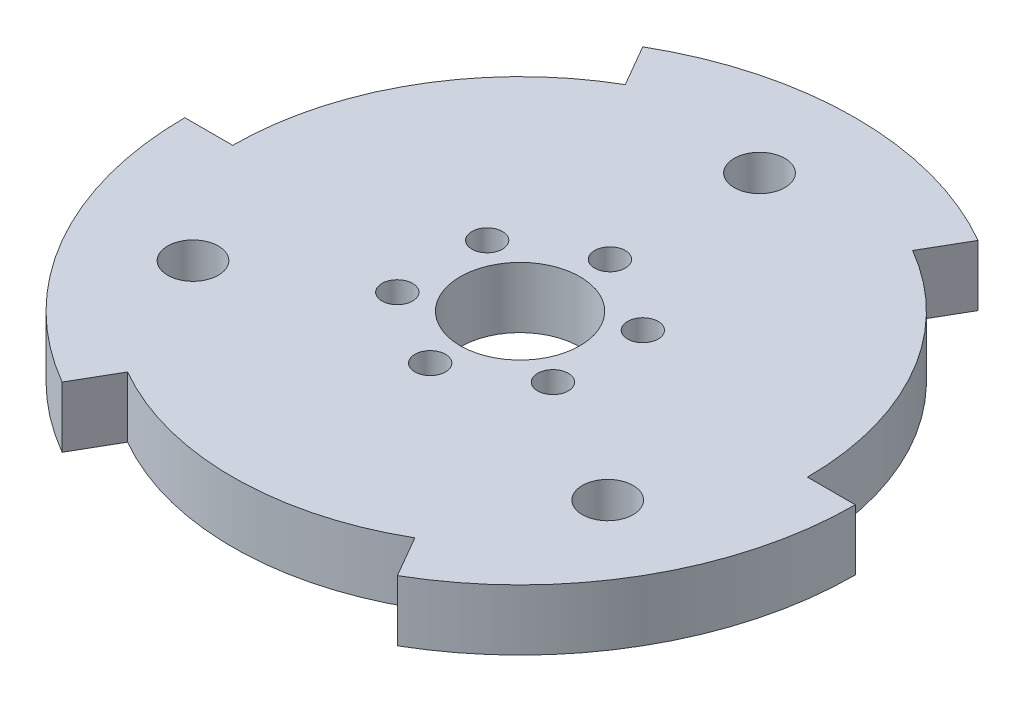
ISO-10303-21;
HEADER;
FILE_DESCRIPTION(('STEP AP214'),'2;1');
FILE_NAME('part.step','',(''),(''),'','','');
FILE_SCHEMA(('AUTOMOTIVE_DESIGN { 1 0 10303 214 1 1 1 1 }'));
ENDSEC;
DATA;
#1=APPLICATION_CONTEXT('core data for automotive mechanical design processes');
#2=APPLICATION_PROTOCOL_DEFINITION('international standard','automotive_design',2000,#1);
#3=PRODUCT_CONTEXT('',#1,'mechanical');
#4=PRODUCT('Part','Part','',(#3));
#5=PRODUCT_RELATED_PRODUCT_CATEGORY('part','',(#4));
#6=PRODUCT_DEFINITION_FORMATION('','',#4);
#7=PRODUCT_DEFINITION_CONTEXT('part definition',#1,'design');
#8=PRODUCT_DEFINITION('design','',#6,#7);
#9=PRODUCT_DEFINITION_SHAPE('','',#8);
#10=(LENGTH_UNIT() NAMED_UNIT(*) SI_UNIT(.MILLI.,.METRE.));
#11=(NAMED_UNIT(*) PLANE_ANGLE_UNIT() SI_UNIT($,.RADIAN.));
#12=(NAMED_UNIT(*) SI_UNIT($,.STERADIAN.) SOLID_ANGLE_UNIT());
#13=UNCERTAINTY_MEASURE_WITH_UNIT(LENGTH_MEASURE(1.E-05),#10,'distance_accuracy_value','');
#14=(GEOMETRIC_REPRESENTATION_CONTEXT(3) GLOBAL_UNCERTAINTY_ASSIGNED_CONTEXT((#13)) GLOBAL_UNIT_ASSIGNED_CONTEXT((#10,
#11,#12)) REPRESENTATION_CONTEXT('',''));
#15=CARTESIAN_POINT('',(0.,0.,0.));
#16=DIRECTION('',(0.,0.,1.));
#17=DIRECTION('',(1.,0.,0.));
#18=AXIS2_PLACEMENT_3D('',#15,#16,#17);
#19=CARTESIAN_POINT('',(-1.051620219116E-13,6.35,0.));
#20=DIRECTION('',(-0.866025403784433,0.,-0.50000000000001));
#21=DIRECTION('',(-0.50000000000001,0.,0.866025403784433));
#22=AXIS2_PLACEMENT_3D('',#19,#20,#21);
#23=PLANE('',#22);
#24=DIRECTION('',(0.50000000000001,0.,-0.866025403784433));
#25=VECTOR('',#24,1.);
#26=CARTESIAN_POINT('',(-1.051620219116E-13,0.,0.));
#27=LINE('',#26,#25);
#28=CARTESIAN_POINT('',(-17.5000000000005,0.,30.3108891324551));
#29=VERTEX_POINT('',#28);
#30=CARTESIAN_POINT('',(-15.0000000000004,0.,25.9807621135329));
#31=VERTEX_POINT('',#30);
#32=EDGE_CURVE('E413',#29,#31,#27,.T.);
#33=ORIENTED_EDGE('',*,*,#32,.T.);
#34=DIRECTION('',(0.,-1.,0.));
#35=VECTOR('',#34,1.);
#36=CARTESIAN_POINT('',(-15.0000000000004,6.35,25.9807621135329));
#37=LINE('',#36,#35);
#38=CARTESIAN_POINT('',(-15.0000000000004,6.35,25.9807621135329));
#39=VERTEX_POINT('',#38);
#40=EDGE_CURVE('E174',#39,#31,#37,.T.);
#41=ORIENTED_EDGE('',*,*,#40,.F.);
#42=DIRECTION('',(0.50000000000001,0.,-0.866025403784433));
#43=VECTOR('',#42,1.);
#44=CARTESIAN_POINT('',(-1.051620219116E-13,6.35,0.));
#45=LINE('',#44,#43);
#46=CARTESIAN_POINT('',(-17.5000000000005,6.35,30.3108891324551));
#47=VERTEX_POINT('',#46);
#48=EDGE_CURVE('E402',#47,#39,#45,.T.);
#49=ORIENTED_EDGE('',*,*,#48,.F.);
#50=DIRECTION('',(0.,-1.,0.));
#51=VECTOR('',#50,1.);
#52=CARTESIAN_POINT('',(-17.5000000000005,6.35,30.3108891324551));
#53=LINE('',#52,#51);
#54=EDGE_CURVE('E12',#47,#29,#53,.T.);
#55=ORIENTED_EDGE('',*,*,#54,.T.);
#56=EDGE_LOOP('',(#33,#41,#49,#55));
#57=FACE_BOUND('',#56,.T.);
#58=ADVANCED_FACE('F163',(#57),#23,.F.);
#59=CARTESIAN_POINT('',(0.,6.35,4.00721122950642E-13));
#60=DIRECTION('',(0.,0.,-1.));
#61=DIRECTION('',(-1.,0.,0.));
#62=AXIS2_PLACEMENT_3D('',#59,#60,#61);
#63=PLANE('',#62);
#64=DIRECTION('',(1.,0.,0.));
#65=VECTOR('',#64,1.);
#66=CARTESIAN_POINT('',(0.,0.,4.00721122950642E-13));
#67=LINE('',#66,#65);
#68=CARTESIAN_POINT('',(-35.,0.,-1.21430643318376E-13));
#69=VERTEX_POINT('',#68);
#70=CARTESIAN_POINT('',(-30.,0.,0.));
#71=VERTEX_POINT('',#70);
#72=EDGE_CURVE('E403',#69,#71,#67,.T.);
#73=ORIENTED_EDGE('',*,*,#72,.F.);
#74=DIRECTION('',(0.,-1.,0.));
#75=VECTOR('',#74,1.);
#76=CARTESIAN_POINT('',(-35.,6.35,-1.21430643318376E-13));
#77=LINE('',#76,#75);
#78=CARTESIAN_POINT('',(-35.,6.35,-1.21430643318376E-13));
#79=VERTEX_POINT('',#78);
#80=EDGE_CURVE('E183',#79,#69,#77,.T.);
#81=ORIENTED_EDGE('',*,*,#80,.F.);
#82=DIRECTION('',(1.,0.,0.));
#83=VECTOR('',#82,1.);
#84=CARTESIAN_POINT('',(0.,6.35,4.00721122950642E-13));
#85=LINE('',#84,#83);
#86=CARTESIAN_POINT('',(-30.,6.35,0.));
#87=VERTEX_POINT('',#86);
#88=EDGE_CURVE('E407',#79,#87,#85,.T.);
#89=ORIENTED_EDGE('',*,*,#88,.T.);
#90=DIRECTION('',(0.,-1.,0.));
#91=VECTOR('',#90,1.);
#92=CARTESIAN_POINT('',(-30.,6.35,0.));
#93=LINE('',#92,#91);
#94=EDGE_CURVE('E422',#87,#71,#93,.T.);
#95=ORIENTED_EDGE('',*,*,#94,.T.);
#96=EDGE_LOOP('',(#73,#81,#89,#95));
#97=FACE_BOUND('',#96,.T.);
#98=ADVANCED_FACE('F470',(#97),#63,.T.);
#99=CARTESIAN_POINT('',(0.,6.35,0.));
#100=DIRECTION('',(0.,-1.,0.));
#101=DIRECTION('',(0.,0.,-1.));
#102=AXIS2_PLACEMENT_3D('',#99,#100,#101);
#103=CYLINDRICAL_SURFACE('',#102,35.);
#104=CARTESIAN_POINT('',(0.,0.,0.));
#105=DIRECTION('',(0.,1.,0.));
#106=DIRECTION('',(0.,0.,1.));
#107=AXIS2_PLACEMENT_3D('',#104,#105,#106);
#108=CIRCLE('',#107,35.);
#109=EDGE_CURVE('E410',#29,#69,#108,.F.);
#110=ORIENTED_EDGE('',*,*,#109,.F.);
#111=ORIENTED_EDGE('',*,*,#54,.F.);
#112=CARTESIAN_POINT('',(0.,6.35,0.));
#113=DIRECTION('',(0.,1.,0.));
#114=DIRECTION('',(0.,0.,1.));
#115=AXIS2_PLACEMENT_3D('',#112,#113,#114);
#116=CIRCLE('',#115,35.);
#117=EDGE_CURVE('E399',#47,#79,#116,.F.);
#118=ORIENTED_EDGE('',*,*,#117,.T.);
#119=ORIENTED_EDGE('',*,*,#80,.T.);
#120=EDGE_LOOP('',(#110,#111,#118,#119));
#121=FACE_BOUND('',#120,.T.);
#122=ADVANCED_FACE('F476',(#121),#103,.T.);
#123=CARTESIAN_POINT('',(0.,0.,0.));
#124=DIRECTION('',(0.,1.,0.));
#125=DIRECTION('',(0.,0.,1.));
#126=AXIS2_PLACEMENT_3D('',#123,#124,#125);
#127=PLANE('',#126);
#128=CARTESIAN_POINT('',(0.,0.,9.385));
#129=DIRECTION('',(0.,1.,0.));
#130=DIRECTION('',(0.,0.,1.));
#131=AXIS2_PLACEMENT_3D('',#128,#129,#130);
#132=CIRCLE('',#131,1.6);
#133=CARTESIAN_POINT('',(0.,0.,10.985));
#134=VERTEX_POINT('',#133);
#135=EDGE_CURVE('E307',#134,#134,#132,.F.);
#136=ORIENTED_EDGE('',*,*,#135,.F.);
#137=EDGE_LOOP('',(#136));
#138=FACE_BOUND('',#137,.T.);
#139=CARTESIAN_POINT('',(8.1276484145169,0.,4.69250000000009));
#140=DIRECTION('',(0.,1.,0.));
#141=DIRECTION('',(0.,0.,1.));
#142=AXIS2_PLACEMENT_3D('',#139,#140,#141);
#143=CIRCLE('',#142,1.6);
#144=CARTESIAN_POINT('',(8.1276484145169,0.,6.29250000000009));
#145=VERTEX_POINT('',#144);
#146=EDGE_CURVE('E388',#145,#145,#143,.F.);
#147=ORIENTED_EDGE('',*,*,#146,.F.);
#148=EDGE_LOOP('',(#147));
#149=FACE_BOUND('',#148,.T.);
#150=CARTESIAN_POINT('',(8.127648414517,0.,-4.69249999999992));
#151=DIRECTION('',(0.,1.,0.));
#152=DIRECTION('',(0.,0.,1.));
#153=AXIS2_PLACEMENT_3D('',#150,#151,#152);
#154=CIRCLE('',#153,1.6);
#155=CARTESIAN_POINT('',(8.127648414517,0.,-3.09249999999992));
#156=VERTEX_POINT('',#155);
#157=EDGE_CURVE('E380',#156,#156,#154,.F.);
#158=ORIENTED_EDGE('',*,*,#157,.F.);
#159=EDGE_LOOP('',(#158));
#160=FACE_BOUND('',#159,.T.);
#161=CARTESIAN_POINT('',(0.,0.,-9.385));
#162=DIRECTION('',(0.,1.,0.));
#163=DIRECTION('',(0.,0.,1.));
#164=AXIS2_PLACEMENT_3D('',#161,#162,#163);
#165=CIRCLE('',#164,1.6);
#166=CARTESIAN_POINT('',(0.,0.,-7.785));
#167=VERTEX_POINT('',#166);
#168=EDGE_CURVE('E372',#167,#167,#165,.F.);
#169=ORIENTED_EDGE('',*,*,#168,.F.);
#170=EDGE_LOOP('',(#169));
#171=FACE_BOUND('',#170,.T.);
#172=CARTESIAN_POINT('',(-8.12764841451694,0.,-4.69250000000004));
#173=DIRECTION('',(0.,1.,0.));
#174=DIRECTION('',(0.,0.,1.));
#175=AXIS2_PLACEMENT_3D('',#172,#173,#174);
#176=CIRCLE('',#175,1.6);
#177=CARTESIAN_POINT('',(-8.12764841451694,0.,-3.09250000000004));
#178=VERTEX_POINT('',#177);
#179=EDGE_CURVE('E364',#178,#178,#176,.F.);
#180=ORIENTED_EDGE('',*,*,#179,.F.);
#181=EDGE_LOOP('',(#180));
#182=FACE_BOUND('',#181,.T.);
#183=CARTESIAN_POINT('',(-8.12764841451697,0.,4.69249999999998));
#184=DIRECTION('',(0.,1.,0.));
#185=DIRECTION('',(0.,0.,1.));
#186=AXIS2_PLACEMENT_3D('',#183,#184,#185);
#187=CIRCLE('',#186,1.6);
#188=CARTESIAN_POINT('',(-8.12764841451697,0.,6.29249999999998));
#189=VERTEX_POINT('',#188);
#190=EDGE_CURVE('E356',#189,#189,#187,.F.);
#191=ORIENTED_EDGE('',*,*,#190,.F.);
#192=EDGE_LOOP('',(#191));
#193=FACE_BOUND('',#192,.T.);
#194=ORIENTED_EDGE('',*,*,#109,.T.);
#195=ORIENTED_EDGE('',*,*,#72,.T.);
#196=CARTESIAN_POINT('',(0.,0.,0.));
#197=DIRECTION('',(0.,1.,0.));
#198=DIRECTION('',(0.,0.,1.));
#199=AXIS2_PLACEMENT_3D('',#196,#197,#198);
#200=CIRCLE('',#199,30.);
#201=CARTESIAN_POINT('',(-14.9999999999998,0.,-25.9807621135333));
#202=VERTEX_POINT('',#201);
#203=EDGE_CURVE('E167',#202,#71,#200,.T.);
#204=ORIENTED_EDGE('',*,*,#203,.F.);
#205=DIRECTION('',(0.499999999999998,0.,0.86602540378444));
#206=VECTOR('',#205,1.);
#207=CARTESIAN_POINT('',(1.06664336510338E-13,0.,0.));
#208=LINE('',#207,#206);
#209=CARTESIAN_POINT('',(-17.4999999999998,0.,-30.3108891324555));
#210=VERTEX_POINT('',#209);
#211=EDGE_CURVE('E276',#210,#202,#208,.T.);
#212=ORIENTED_EDGE('',*,*,#211,.F.);
#213=CARTESIAN_POINT('',(0.,0.,0.));
#214=DIRECTION('',(0.,1.,0.));
#215=DIRECTION('',(0.,0.,1.));
#216=AXIS2_PLACEMENT_3D('',#213,#214,#215);
#217=CIRCLE('',#216,35.);
#218=CARTESIAN_POINT('',(17.4999999999998,0.,-30.3108891324555));
#219=VERTEX_POINT('',#218);
#220=EDGE_CURVE('E256',#210,#219,#217,.F.);
#221=ORIENTED_EDGE('',*,*,#220,.T.);
#222=DIRECTION('',(-0.500000000000005,0.,0.866025403784436));
#223=VECTOR('',#222,1.);
#224=CARTESIAN_POINT('',(-3.41025413913334E-13,0.,-1.96891114523369E-13));
#225=LINE('',#224,#223);
#226=CARTESIAN_POINT('',(14.9999999999998,0.,-25.9807621135333));
#227=VERTEX_POINT('',#226);
#228=EDGE_CURVE('E273',#219,#227,#225,.T.);
#229=ORIENTED_EDGE('',*,*,#228,.T.);
#230=CARTESIAN_POINT('',(30.,0.,3.33066907387547E-13));
#231=VERTEX_POINT('',#230);
#232=EDGE_CURVE('E247',#231,#227,#200,.T.);
#233=ORIENTED_EDGE('',*,*,#232,.F.);
#234=DIRECTION('',(-1.,0.,0.));
#235=VECTOR('',#234,1.);
#236=CARTESIAN_POINT('',(0.,0.,1.04083408558609E-13));
#237=LINE('',#236,#235);
#238=CARTESIAN_POINT('',(35.,0.,3.71230823859037E-13));
#239=VERTEX_POINT('',#238);
#240=EDGE_CURVE('E443',#239,#231,#237,.T.);
#241=ORIENTED_EDGE('',*,*,#240,.F.);
#242=CARTESIAN_POINT('',(0.,0.,0.));
#243=DIRECTION('',(0.,1.,0.));
#244=DIRECTION('',(0.,0.,1.));
#245=AXIS2_PLACEMENT_3D('',#242,#243,#244);
#246=CIRCLE('',#245,35.);
#247=CARTESIAN_POINT('',(17.5,0.,30.3108891324553));
#248=VERTEX_POINT('',#247);
#249=EDGE_CURVE('E297',#239,#248,#246,.F.);
#250=ORIENTED_EDGE('',*,*,#249,.T.);
#251=DIRECTION('',(-0.499999999999992,0.,-0.866025403784444));
#252=VECTOR('',#251,1.);
#253=CARTESIAN_POINT('',(3.395230993146E-13,0.,-1.96023752785376E-13));
#254=LINE('',#253,#252);
#255=CARTESIAN_POINT('',(15.0000000000001,0.,25.9807621135331));
#256=VERTEX_POINT('',#255);
#257=EDGE_CURVE('E432',#248,#256,#254,.T.);
#258=ORIENTED_EDGE('',*,*,#257,.T.);
#259=EDGE_CURVE('E344',#31,#256,#200,.T.);
#260=ORIENTED_EDGE('',*,*,#259,.F.);
#261=ORIENTED_EDGE('',*,*,#32,.F.);
#262=EDGE_LOOP('',(#194,#195,#204,#212,#221,#229,#233,#241,#250,#258,#260,#261));
#263=FACE_BOUND('',#262,.T.);
#264=CARTESIAN_POINT('',(0.,0.,0.));
#265=DIRECTION('',(0.,1.,0.));
#266=DIRECTION('',(0.,0.,1.));
#267=AXIS2_PLACEMENT_3D('',#264,#265,#266);
#268=CIRCLE('',#267,6.25);
#269=CARTESIAN_POINT('',(0.,0.,6.25));
#270=VERTEX_POINT('',#269);
#271=EDGE_CURVE('E320',#270,#270,#268,.T.);
#272=ORIENTED_EDGE('',*,*,#271,.T.);
#273=EDGE_LOOP('',(#272));
#274=FACE_BOUND('',#273,.T.);
#275=CARTESIAN_POINT('',(21.6506350946122,0.,12.4999999999993));
#276=DIRECTION('',(0.,1.,0.));
#277=DIRECTION('',(0.,0.,1.));
#278=AXIS2_PLACEMENT_3D('',#275,#276,#277);
#279=CIRCLE('',#278,2.65);
#280=CARTESIAN_POINT('',(21.6506350946122,0.,15.1499999999993));
#281=VERTEX_POINT('',#280);
#282=EDGE_CURVE('E312',#281,#281,#279,.T.);
#283=ORIENTED_EDGE('',*,*,#282,.T.);
#284=EDGE_LOOP('',(#283));
#285=FACE_BOUND('',#284,.T.);
#286=CARTESIAN_POINT('',(-21.6506350946098,0.,12.5000000000007));
#287=DIRECTION('',(0.,1.,0.));
#288=DIRECTION('',(0.,0.,1.));
#289=AXIS2_PLACEMENT_3D('',#286,#287,#288);
#290=CIRCLE('',#289,2.65);
#291=CARTESIAN_POINT('',(-21.6506350946098,0.,15.1500000000007));
#292=VERTEX_POINT('',#291);
#293=EDGE_CURVE('E302',#292,#292,#290,.T.);
#294=ORIENTED_EDGE('',*,*,#293,.T.);
#295=EDGE_LOOP('',(#294));
#296=FACE_BOUND('',#295,.T.);
#297=CARTESIAN_POINT('',(0.,0.,-25.));
#298=DIRECTION('',(0.,1.,0.));
#299=DIRECTION('',(0.,0.,1.));
#300=AXIS2_PLACEMENT_3D('',#297,#298,#299);
#301=CIRCLE('',#300,2.65);
#302=CARTESIAN_POINT('',(0.,0.,-22.35));
#303=VERTEX_POINT('',#302);
#304=EDGE_CURVE('E303',#303,#303,#301,.T.);
#305=ORIENTED_EDGE('',*,*,#304,.T.);
#306=EDGE_LOOP('',(#305));
#307=FACE_BOUND('',#306,.T.);
#308=ADVANCED_FACE('F271',(#138,#149,#160,#171,#182,#193,#263,#274,#285,#296,#307),#127,.F.);
#309=CARTESIAN_POINT('',(0.,6.35,0.));
#310=DIRECTION('',(0.,1.,0.));
#311=DIRECTION('',(0.,0.,1.));
#312=AXIS2_PLACEMENT_3D('',#309,#310,#311);
#313=PLANE('',#312);
#314=CARTESIAN_POINT('',(0.,6.35,9.385));
#315=DIRECTION('',(0.,1.,0.));
#316=DIRECTION('',(0.,0.,1.));
#317=AXIS2_PLACEMENT_3D('',#314,#315,#316);
#318=CIRCLE('',#317,1.6);
#319=CARTESIAN_POINT('',(0.,6.35,10.985));
#320=VERTEX_POINT('',#319);
#321=EDGE_CURVE('E352',#320,#320,#318,.T.);
#322=ORIENTED_EDGE('',*,*,#321,.F.);
#323=EDGE_LOOP('',(#322));
#324=FACE_BOUND('',#323,.T.);
#325=CARTESIAN_POINT('',(8.1276484145169,6.35,4.69250000000009));
#326=DIRECTION('',(0.,1.,0.));
#327=DIRECTION('',(0.,0.,1.));
#328=AXIS2_PLACEMENT_3D('',#325,#326,#327);
#329=CIRCLE('',#328,1.6);
#330=CARTESIAN_POINT('',(8.1276484145169,6.35,6.29250000000009));
#331=VERTEX_POINT('',#330);
#332=EDGE_CURVE('E392',#331,#331,#329,.T.);
#333=ORIENTED_EDGE('',*,*,#332,.F.);
#334=EDGE_LOOP('',(#333));
#335=FACE_BOUND('',#334,.T.);
#336=CARTESIAN_POINT('',(8.127648414517,6.35,-4.69249999999992));
#337=DIRECTION('',(0.,1.,0.));
#338=DIRECTION('',(0.,0.,1.));
#339=AXIS2_PLACEMENT_3D('',#336,#337,#338);
#340=CIRCLE('',#339,1.6);
#341=CARTESIAN_POINT('',(8.127648414517,6.35,-3.09249999999992));
#342=VERTEX_POINT('',#341);
#343=EDGE_CURVE('E384',#342,#342,#340,.T.);
#344=ORIENTED_EDGE('',*,*,#343,.F.);
#345=EDGE_LOOP('',(#344));
#346=FACE_BOUND('',#345,.T.);
#347=CARTESIAN_POINT('',(0.,6.35,-9.385));
#348=DIRECTION('',(0.,1.,0.));
#349=DIRECTION('',(0.,0.,1.));
#350=AXIS2_PLACEMENT_3D('',#347,#348,#349);
#351=CIRCLE('',#350,1.6);
#352=CARTESIAN_POINT('',(0.,6.35,-7.785));
#353=VERTEX_POINT('',#352);
#354=EDGE_CURVE('E376',#353,#353,#351,.T.);
#355=ORIENTED_EDGE('',*,*,#354,.F.);
#356=EDGE_LOOP('',(#355));
#357=FACE_BOUND('',#356,.T.);
#358=CARTESIAN_POINT('',(-8.12764841451694,6.35,-4.69250000000004));
#359=DIRECTION('',(0.,1.,0.));
#360=DIRECTION('',(0.,0.,1.));
#361=AXIS2_PLACEMENT_3D('',#358,#359,#360);
#362=CIRCLE('',#361,1.6);
#363=CARTESIAN_POINT('',(-8.12764841451694,6.35,-3.09250000000004));
#364=VERTEX_POINT('',#363);
#365=EDGE_CURVE('E368',#364,#364,#362,.T.);
#366=ORIENTED_EDGE('',*,*,#365,.F.);
#367=EDGE_LOOP('',(#366));
#368=FACE_BOUND('',#367,.T.);
#369=CARTESIAN_POINT('',(-8.12764841451697,6.35,4.69249999999998));
#370=DIRECTION('',(0.,1.,0.));
#371=DIRECTION('',(0.,0.,1.));
#372=AXIS2_PLACEMENT_3D('',#369,#370,#371);
#373=CIRCLE('',#372,1.6);
#374=CARTESIAN_POINT('',(-8.12764841451697,6.35,6.29249999999998));
#375=VERTEX_POINT('',#374);
#376=EDGE_CURVE('E360',#375,#375,#373,.T.);
#377=ORIENTED_EDGE('',*,*,#376,.F.);
#378=EDGE_LOOP('',(#377));
#379=FACE_BOUND('',#378,.T.);
#380=ORIENTED_EDGE('',*,*,#117,.F.);
#381=ORIENTED_EDGE('',*,*,#48,.T.);
#382=CARTESIAN_POINT('',(0.,6.35,0.));
#383=DIRECTION('',(0.,1.,0.));
#384=DIRECTION('',(0.,0.,1.));
#385=AXIS2_PLACEMENT_3D('',#382,#383,#384);
#386=CIRCLE('',#385,30.);
#387=CARTESIAN_POINT('',(15.0000000000001,6.35,25.9807621135331));
#388=VERTEX_POINT('',#387);
#389=EDGE_CURVE('E332',#39,#388,#386,.T.);
#390=ORIENTED_EDGE('',*,*,#389,.T.);
#391=DIRECTION('',(-0.499999999999992,0.,-0.866025403784444));
#392=VECTOR('',#391,1.);
#393=CARTESIAN_POINT('',(3.395230993146E-13,6.35,-1.96023752785376E-13));
#394=LINE('',#393,#392);
#395=CARTESIAN_POINT('',(17.5,6.35,30.3108891324553));
#396=VERTEX_POINT('',#395);
#397=EDGE_CURVE('E435',#396,#388,#394,.T.);
#398=ORIENTED_EDGE('',*,*,#397,.F.);
#399=CARTESIAN_POINT('',(0.,6.35,0.));
#400=DIRECTION('',(0.,1.,0.));
#401=DIRECTION('',(0.,0.,1.));
#402=AXIS2_PLACEMENT_3D('',#399,#400,#401);
#403=CIRCLE('',#402,35.);
#404=CARTESIAN_POINT('',(35.,6.35,3.71230823859037E-13));
#405=VERTEX_POINT('',#404);
#406=EDGE_CURVE('E427',#405,#396,#403,.F.);
#407=ORIENTED_EDGE('',*,*,#406,.F.);
#408=DIRECTION('',(-1.,0.,0.));
#409=VECTOR('',#408,1.);
#410=CARTESIAN_POINT('',(0.,6.35,1.04083408558609E-13));
#411=LINE('',#410,#409);
#412=CARTESIAN_POINT('',(30.,6.35,3.33066907387547E-13));
#413=VERTEX_POINT('',#412);
#414=EDGE_CURVE('E431',#405,#413,#411,.T.);
#415=ORIENTED_EDGE('',*,*,#414,.T.);
#416=CARTESIAN_POINT('',(14.9999999999998,6.35,-25.9807621135333));
#417=VERTEX_POINT('',#416);
#418=EDGE_CURVE('E333',#413,#417,#386,.T.);
#419=ORIENTED_EDGE('',*,*,#418,.T.);
#420=DIRECTION('',(-0.500000000000005,0.,0.866025403784436));
#421=VECTOR('',#420,1.);
#422=CARTESIAN_POINT('',(-3.41025413913334E-13,6.35,-1.96891114523369E-13));
#423=LINE('',#422,#421);
#424=CARTESIAN_POINT('',(17.4999999999998,6.35,-30.3108891324555));
#425=VERTEX_POINT('',#424);
#426=EDGE_CURVE('E265',#425,#417,#423,.T.);
#427=ORIENTED_EDGE('',*,*,#426,.F.);
#428=CARTESIAN_POINT('',(0.,6.35,0.));
#429=DIRECTION('',(0.,1.,0.));
#430=DIRECTION('',(0.,0.,1.));
#431=AXIS2_PLACEMENT_3D('',#428,#429,#430);
#432=CIRCLE('',#431,35.);
#433=CARTESIAN_POINT('',(-17.4999999999998,6.35,-30.3108891324555));
#434=VERTEX_POINT('',#433);
#435=EDGE_CURVE('E258',#434,#425,#432,.F.);
#436=ORIENTED_EDGE('',*,*,#435,.F.);
#437=DIRECTION('',(0.499999999999998,0.,0.86602540378444));
#438=VECTOR('',#437,1.);
#439=CARTESIAN_POINT('',(1.06664336510338E-13,6.35,0.));
#440=LINE('',#439,#438);
#441=CARTESIAN_POINT('',(-14.9999999999998,6.35,-25.9807621135333));
#442=VERTEX_POINT('',#441);
#443=EDGE_CURVE('E285',#434,#442,#440,.T.);
#444=ORIENTED_EDGE('',*,*,#443,.T.);
#445=EDGE_CURVE('E278',#442,#87,#386,.T.);
#446=ORIENTED_EDGE('',*,*,#445,.T.);
#447=ORIENTED_EDGE('',*,*,#88,.F.);
#448=EDGE_LOOP('',(#380,#381,#390,#398,#407,#415,#419,#427,#436,#444,#446,#447));
#449=FACE_BOUND('',#448,.T.);
#450=CARTESIAN_POINT('',(-21.6506350946098,6.35,12.5000000000007));
#451=DIRECTION('',(0.,1.,0.));
#452=DIRECTION('',(0.,0.,1.));
#453=AXIS2_PLACEMENT_3D('',#450,#451,#452);
#454=CIRCLE('',#453,2.65);
#455=CARTESIAN_POINT('',(-21.6506350946098,6.35,15.1500000000007));
#456=VERTEX_POINT('',#455);
#457=EDGE_CURVE('E308',#456,#456,#454,.T.);
#458=ORIENTED_EDGE('',*,*,#457,.F.);
#459=EDGE_LOOP('',(#458));
#460=FACE_BOUND('',#459,.T.);
#461=CARTESIAN_POINT('',(0.,6.35,0.));
#462=DIRECTION('',(0.,1.,0.));
#463=DIRECTION('',(0.,0.,1.));
#464=AXIS2_PLACEMENT_3D('',#461,#462,#463);
#465=CIRCLE('',#464,6.25);
#466=CARTESIAN_POINT('',(0.,6.35,6.25));
#467=VERTEX_POINT('',#466);
#468=EDGE_CURVE('E324',#467,#467,#465,.T.);
#469=ORIENTED_EDGE('',*,*,#468,.F.);
#470=EDGE_LOOP('',(#469));
#471=FACE_BOUND('',#470,.T.);
#472=CARTESIAN_POINT('',(21.6506350946122,6.35,12.4999999999993));
#473=DIRECTION('',(0.,1.,0.));
#474=DIRECTION('',(0.,0.,1.));
#475=AXIS2_PLACEMENT_3D('',#472,#473,#474);
#476=CIRCLE('',#475,2.65);
#477=CARTESIAN_POINT('',(21.6506350946122,6.35,15.1499999999993));
#478=VERTEX_POINT('',#477);
#479=EDGE_CURVE('E316',#478,#478,#476,.T.);
#480=ORIENTED_EDGE('',*,*,#479,.F.);
#481=EDGE_LOOP('',(#480));
#482=FACE_BOUND('',#481,.T.);
#483=CARTESIAN_POINT('',(0.,6.35,-25.));
#484=DIRECTION('',(0.,1.,0.));
#485=DIRECTION('',(0.,0.,1.));
#486=AXIS2_PLACEMENT_3D('',#483,#484,#485);
#487=CIRCLE('',#486,2.65);
#488=CARTESIAN_POINT('',(0.,6.35,-22.35));
#489=VERTEX_POINT('',#488);
#490=EDGE_CURVE('E298',#489,#489,#487,.T.);
#491=ORIENTED_EDGE('',*,*,#490,.F.);
#492=EDGE_LOOP('',(#491));
#493=FACE_BOUND('',#492,.T.);
#494=ADVANCED_FACE('F465',(#324,#335,#346,#357,#368,#379,#449,#460,#471,#482,#493),#313,.T.);
#495=CARTESIAN_POINT('',(0.,6.35,0.));
#496=DIRECTION('',(0.,-1.,0.));
#497=DIRECTION('',(0.,0.,-1.));
#498=AXIS2_PLACEMENT_3D('',#495,#496,#497);
#499=CYLINDRICAL_SURFACE('',#498,35.);
#500=ORIENTED_EDGE('',*,*,#249,.F.);
#501=DIRECTION('',(0.,-1.,0.));
#502=VECTOR('',#501,1.);
#503=CARTESIAN_POINT('',(35.,6.35,3.71230823859037E-13));
#504=LINE('',#503,#502);
#505=EDGE_CURVE('E414',#405,#239,#504,.T.);
#506=ORIENTED_EDGE('',*,*,#505,.F.);
#507=ORIENTED_EDGE('',*,*,#406,.T.);
#508=DIRECTION('',(0.,-1.,0.));
#509=VECTOR('',#508,1.);
#510=CARTESIAN_POINT('',(17.5,6.35,30.3108891324553));
#511=LINE('',#510,#509);
#512=EDGE_CURVE('E439',#396,#248,#511,.T.);
#513=ORIENTED_EDGE('',*,*,#512,.T.);
#514=EDGE_LOOP('',(#500,#506,#507,#513));
#515=FACE_BOUND('',#514,.T.);
#516=ADVANCED_FACE('F492',(#515),#499,.T.);
#517=CARTESIAN_POINT('',(0.,6.35,1.04083408558609E-13));
#518=DIRECTION('',(0.,0.,1.));
#519=DIRECTION('',(1.,0.,0.));
#520=AXIS2_PLACEMENT_3D('',#517,#518,#519);
#521=PLANE('',#520);
#522=ORIENTED_EDGE('',*,*,#240,.T.);
#523=DIRECTION('',(0.,-1.,0.));
#524=VECTOR('',#523,1.);
#525=CARTESIAN_POINT('',(30.,6.35,3.33066907387547E-13));
#526=LINE('',#525,#524);
#527=EDGE_CURVE('E456',#413,#231,#526,.T.);
#528=ORIENTED_EDGE('',*,*,#527,.F.);
#529=ORIENTED_EDGE('',*,*,#414,.F.);
#530=ORIENTED_EDGE('',*,*,#505,.T.);
#531=EDGE_LOOP('',(#522,#528,#529,#530));
#532=FACE_BOUND('',#531,.T.);
#533=ADVANCED_FACE('F496',(#532),#521,.F.);
#534=CARTESIAN_POINT('',(-3.41025413913334E-13,6.35,-1.96891114523369E-13));
#535=DIRECTION('',(0.866025403784436,0.,0.500000000000005));
#536=DIRECTION('',(0.500000000000005,0.,-0.866025403784436));
#537=AXIS2_PLACEMENT_3D('',#534,#535,#536);
#538=PLANE('',#537);
#539=ORIENTED_EDGE('',*,*,#228,.F.);
#540=DIRECTION('',(0.,-1.,0.));
#541=VECTOR('',#540,1.);
#542=CARTESIAN_POINT('',(17.4999999999998,6.35,-30.3108891324555));
#543=LINE('',#542,#541);
#544=EDGE_CURVE('E253',#425,#219,#543,.T.);
#545=ORIENTED_EDGE('',*,*,#544,.F.);
#546=ORIENTED_EDGE('',*,*,#426,.T.);
#547=DIRECTION('',(0.,-1.,0.));
#548=VECTOR('',#547,1.);
#549=CARTESIAN_POINT('',(14.9999999999998,6.35,-25.9807621135333));
#550=LINE('',#549,#548);
#551=EDGE_CURVE('E264',#417,#227,#550,.T.);
#552=ORIENTED_EDGE('',*,*,#551,.T.);
#553=EDGE_LOOP('',(#539,#545,#546,#552));
#554=FACE_BOUND('',#553,.T.);
#555=ADVANCED_FACE('F280',(#554),#538,.T.);
#556=CARTESIAN_POINT('',(0.,6.35,0.));
#557=DIRECTION('',(0.,-1.,0.));
#558=DIRECTION('',(0.,0.,-1.));
#559=AXIS2_PLACEMENT_3D('',#556,#557,#558);
#560=CYLINDRICAL_SURFACE('',#559,35.);
#561=ORIENTED_EDGE('',*,*,#220,.F.);
#562=DIRECTION('',(0.,-1.,0.));
#563=VECTOR('',#562,1.);
#564=CARTESIAN_POINT('',(-17.4999999999998,6.35,-30.3108891324555));
#565=LINE('',#564,#563);
#566=EDGE_CURVE('E294',#434,#210,#565,.T.);
#567=ORIENTED_EDGE('',*,*,#566,.F.);
#568=ORIENTED_EDGE('',*,*,#435,.T.);
#569=ORIENTED_EDGE('',*,*,#544,.T.);
#570=EDGE_LOOP('',(#561,#567,#568,#569));
#571=FACE_BOUND('',#570,.T.);
#572=ADVANCED_FACE('F255',(#571),#560,.T.);
#573=CARTESIAN_POINT('',(3.395230993146E-13,6.35,-1.96023752785376E-13));
#574=DIRECTION('',(-0.866025403784443,0.,0.499999999999991));
#575=DIRECTION('',(0.499999999999992,0.,0.866025403784444));
#576=AXIS2_PLACEMENT_3D('',#573,#574,#575);
#577=PLANE('',#576);
#578=ORIENTED_EDGE('',*,*,#257,.F.);
#579=ORIENTED_EDGE('',*,*,#512,.F.);
#580=ORIENTED_EDGE('',*,*,#397,.T.);
#581=DIRECTION('',(0.,-1.,0.));
#582=VECTOR('',#581,1.);
#583=CARTESIAN_POINT('',(15.0000000000001,6.35,25.9807621135331));
#584=LINE('',#583,#582);
#585=EDGE_CURVE('E452',#388,#256,#584,.T.);
#586=ORIENTED_EDGE('',*,*,#585,.T.);
#587=EDGE_LOOP('',(#578,#579,#580,#586));
#588=FACE_BOUND('',#587,.T.);
#589=ADVANCED_FACE('F489',(#588),#577,.T.);
#590=CARTESIAN_POINT('',(1.06664336510338E-13,6.35,0.));
#591=DIRECTION('',(0.86602540378444,0.,-0.499999999999998));
#592=DIRECTION('',(-0.499999999999998,0.,-0.86602540378444));
#593=AXIS2_PLACEMENT_3D('',#590,#591,#592);
#594=PLANE('',#593);
#595=ORIENTED_EDGE('',*,*,#211,.T.);
#596=DIRECTION('',(0.,-1.,0.));
#597=VECTOR('',#596,1.);
#598=CARTESIAN_POINT('',(-14.9999999999998,6.35,-25.9807621135333));
#599=LINE('',#598,#597);
#600=EDGE_CURVE('E291',#442,#202,#599,.T.);
#601=ORIENTED_EDGE('',*,*,#600,.F.);
#602=ORIENTED_EDGE('',*,*,#443,.F.);
#603=ORIENTED_EDGE('',*,*,#566,.T.);
#604=EDGE_LOOP('',(#595,#601,#602,#603));
#605=FACE_BOUND('',#604,.T.);
#606=ADVANCED_FACE('F469',(#605),#594,.F.);
#607=CARTESIAN_POINT('',(0.,6.35,-25.));
#608=DIRECTION('',(0.,-1.,0.));
#609=DIRECTION('',(0.,0.,-1.));
#610=AXIS2_PLACEMENT_3D('',#607,#608,#609);
#611=CYLINDRICAL_SURFACE('',#610,2.65);
#612=ORIENTED_EDGE('',*,*,#490,.T.);
#613=EDGE_LOOP('',(#612));
#614=FACE_BOUND('',#613,.T.);
#615=ORIENTED_EDGE('',*,*,#304,.F.);
#616=EDGE_LOOP('',(#615));
#617=FACE_BOUND('',#616,.T.);
#618=ADVANCED_FACE('F508',(#614,#617),#611,.F.);
#619=CARTESIAN_POINT('',(-21.6506350946098,6.35,12.5000000000007));
#620=DIRECTION('',(0.,-1.,0.));
#621=DIRECTION('',(0.,0.,-1.));
#622=AXIS2_PLACEMENT_3D('',#619,#620,#621);
#623=CYLINDRICAL_SURFACE('',#622,2.65);
#624=ORIENTED_EDGE('',*,*,#457,.T.);
#625=EDGE_LOOP('',(#624));
#626=FACE_BOUND('',#625,.T.);
#627=ORIENTED_EDGE('',*,*,#293,.F.);
#628=EDGE_LOOP('',(#627));
#629=FACE_BOUND('',#628,.T.);
#630=ADVANCED_FACE('F535',(#626,#629),#623,.F.);
#631=CARTESIAN_POINT('',(21.6506350946122,6.35,12.4999999999993));
#632=DIRECTION('',(0.,-1.,0.));
#633=DIRECTION('',(0.,0.,-1.));
#634=AXIS2_PLACEMENT_3D('',#631,#632,#633);
#635=CYLINDRICAL_SURFACE('',#634,2.65);
#636=ORIENTED_EDGE('',*,*,#479,.T.);
#637=EDGE_LOOP('',(#636));
#638=FACE_BOUND('',#637,.T.);
#639=ORIENTED_EDGE('',*,*,#282,.F.);
#640=EDGE_LOOP('',(#639));
#641=FACE_BOUND('',#640,.T.);
#642=ADVANCED_FACE('F539',(#638,#641),#635,.F.);
#643=CARTESIAN_POINT('',(0.,6.35,0.));
#644=DIRECTION('',(0.,-1.,0.));
#645=DIRECTION('',(0.,0.,-1.));
#646=AXIS2_PLACEMENT_3D('',#643,#644,#645);
#647=CYLINDRICAL_SURFACE('',#646,6.25);
#648=ORIENTED_EDGE('',*,*,#468,.T.);
#649=EDGE_LOOP('',(#648));
#650=FACE_BOUND('',#649,.T.);
#651=ORIENTED_EDGE('',*,*,#271,.F.);
#652=EDGE_LOOP('',(#651));
#653=FACE_BOUND('',#652,.T.);
#654=ADVANCED_FACE('F510',(#650,#653),#647,.F.);
#655=CARTESIAN_POINT('',(0.,6.35,0.));
#656=DIRECTION('',(0.,-1.,0.));
#657=DIRECTION('',(0.,0.,-1.));
#658=AXIS2_PLACEMENT_3D('',#655,#656,#657);
#659=CYLINDRICAL_SURFACE('',#658,30.);
#660=ORIENTED_EDGE('',*,*,#94,.F.);
#661=ORIENTED_EDGE('',*,*,#445,.F.);
#662=ORIENTED_EDGE('',*,*,#600,.T.);
#663=ORIENTED_EDGE('',*,*,#203,.T.);
#664=EDGE_LOOP('',(#660,#661,#662,#663));
#665=FACE_BOUND('',#664,.T.);
#666=ADVANCED_FACE('F165',(#665),#659,.T.);
#667=ORIENTED_EDGE('',*,*,#389,.F.);
#668=ORIENTED_EDGE('',*,*,#40,.T.);
#669=ORIENTED_EDGE('',*,*,#259,.T.);
#670=ORIENTED_EDGE('',*,*,#585,.F.);
#671=EDGE_LOOP('',(#667,#668,#669,#670));
#672=FACE_BOUND('',#671,.T.);
#673=ADVANCED_FACE('F484',(#672),#659,.T.);
#674=ORIENTED_EDGE('',*,*,#418,.F.);
#675=ORIENTED_EDGE('',*,*,#527,.T.);
#676=ORIENTED_EDGE('',*,*,#232,.T.);
#677=ORIENTED_EDGE('',*,*,#551,.F.);
#678=EDGE_LOOP('',(#674,#675,#676,#677));
#679=FACE_BOUND('',#678,.T.);
#680=ADVANCED_FACE('F497',(#679),#659,.T.);
#681=CARTESIAN_POINT('',(-8.12764841451697,-4.52548339959391,4.69249999999998));
#682=DIRECTION('',(0.,1.,0.));
#683=DIRECTION('',(0.,0.,1.));
#684=AXIS2_PLACEMENT_3D('',#681,#682,#683);
#685=CYLINDRICAL_SURFACE('',#684,1.6);
#686=ORIENTED_EDGE('',*,*,#190,.T.);
#687=EDGE_LOOP('',(#686));
#688=FACE_BOUND('',#687,.T.);
#689=ORIENTED_EDGE('',*,*,#376,.T.);
#690=EDGE_LOOP('',(#689));
#691=FACE_BOUND('',#690,.T.);
#692=ADVANCED_FACE('F499',(#688,#691),#685,.F.);
#693=CARTESIAN_POINT('',(-8.12764841451694,-4.52548339959391,-4.69250000000004));
#694=DIRECTION('',(0.,1.,0.));
#695=DIRECTION('',(0.,0.,1.));
#696=AXIS2_PLACEMENT_3D('',#693,#694,#695);
#697=CYLINDRICAL_SURFACE('',#696,1.6);
#698=ORIENTED_EDGE('',*,*,#179,.T.);
#699=EDGE_LOOP('',(#698));
#700=FACE_BOUND('',#699,.T.);
#701=ORIENTED_EDGE('',*,*,#365,.T.);
#702=EDGE_LOOP('',(#701));
#703=FACE_BOUND('',#702,.T.);
#704=ADVANCED_FACE('F505',(#700,#703),#697,.F.);
#705=CARTESIAN_POINT('',(0.,-4.52548339959391,-9.385));
#706=DIRECTION('',(0.,1.,0.));
#707=DIRECTION('',(0.,0.,1.));
#708=AXIS2_PLACEMENT_3D('',#705,#706,#707);
#709=CYLINDRICAL_SURFACE('',#708,1.6);
#710=ORIENTED_EDGE('',*,*,#168,.T.);
#711=EDGE_LOOP('',(#710));
#712=FACE_BOUND('',#711,.T.);
#713=ORIENTED_EDGE('',*,*,#354,.T.);
#714=EDGE_LOOP('',(#713));
#715=FACE_BOUND('',#714,.T.);
#716=ADVANCED_FACE('F572',(#712,#715),#709,.F.);
#717=CARTESIAN_POINT('',(8.127648414517,-4.52548339959391,-4.69249999999992));
#718=DIRECTION('',(0.,1.,0.));
#719=DIRECTION('',(0.,0.,1.));
#720=AXIS2_PLACEMENT_3D('',#717,#718,#719);
#721=CYLINDRICAL_SURFACE('',#720,1.6);
#722=ORIENTED_EDGE('',*,*,#157,.T.);
#723=EDGE_LOOP('',(#722));
#724=FACE_BOUND('',#723,.T.);
#725=ORIENTED_EDGE('',*,*,#343,.T.);
#726=EDGE_LOOP('',(#725));
#727=FACE_BOUND('',#726,.T.);
#728=ADVANCED_FACE('F568',(#724,#727),#721,.F.);
#729=CARTESIAN_POINT('',(8.1276484145169,-4.52548339959391,4.69250000000009));
#730=DIRECTION('',(0.,1.,0.));
#731=DIRECTION('',(0.,0.,1.));
#732=AXIS2_PLACEMENT_3D('',#729,#730,#731);
#733=CYLINDRICAL_SURFACE('',#732,1.6);
#734=ORIENTED_EDGE('',*,*,#146,.T.);
#735=EDGE_LOOP('',(#734));
#736=FACE_BOUND('',#735,.T.);
#737=ORIENTED_EDGE('',*,*,#332,.T.);
#738=EDGE_LOOP('',(#737));
#739=FACE_BOUND('',#738,.T.);
#740=ADVANCED_FACE('F571',(#736,#739),#733,.F.);
#741=CARTESIAN_POINT('',(0.,-4.52548339959391,9.385));
#742=DIRECTION('',(0.,1.,0.));
#743=DIRECTION('',(0.,0.,1.));
#744=AXIS2_PLACEMENT_3D('',#741,#742,#743);
#745=CYLINDRICAL_SURFACE('',#744,1.6);
#746=ORIENTED_EDGE('',*,*,#135,.T.);
#747=EDGE_LOOP('',(#746));
#748=FACE_BOUND('',#747,.T.);
#749=ORIENTED_EDGE('',*,*,#321,.T.);
#750=EDGE_LOOP('',(#749));
#751=FACE_BOUND('',#750,.T.);
#752=ADVANCED_FACE('F582',(#748,#751),#745,.F.);
#753=CLOSED_SHELL('',(#58,#98,#122,#308,#494,#516,#533,#555,#572,#589,#606,#618,#630,#642,#654,
#666,#673,#680,#692,#704,#716,#728,#740,#752));
#754=MANIFOLD_SOLID_BREP('B2',#753);
#755=ADVANCED_BREP_SHAPE_REPRESENTATION('',(#18,#754),#14);
#756=SHAPE_DEFINITION_REPRESENTATION(#9,#755);
ENDSEC;
END-ISO-10303-21;
